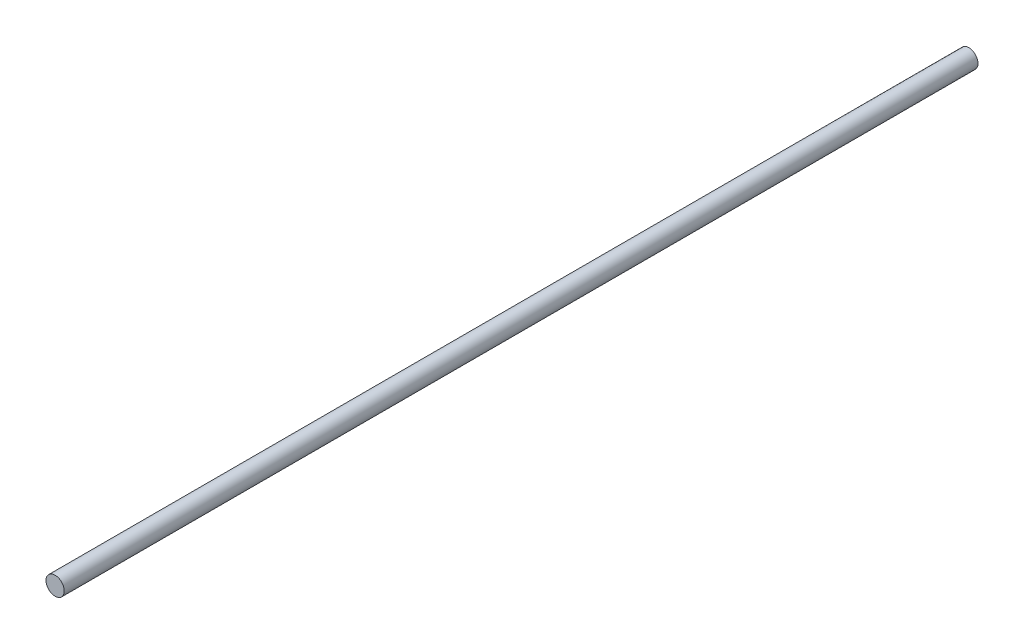
ISO-10303-21;
HEADER;
FILE_DESCRIPTION(('STEP AP214'),'2;1');
FILE_NAME('part.step','',(''),(''),'','','');
FILE_SCHEMA(('AUTOMOTIVE_DESIGN { 1 0 10303 214 1 1 1 1 }'));
ENDSEC;
DATA;
#1=APPLICATION_CONTEXT('core data for automotive mechanical design processes');
#2=APPLICATION_PROTOCOL_DEFINITION('international standard','automotive_design',2000,#1);
#3=PRODUCT_CONTEXT('',#1,'mechanical');
#4=PRODUCT('Part','Part','',(#3));
#5=PRODUCT_RELATED_PRODUCT_CATEGORY('part','',(#4));
#6=PRODUCT_DEFINITION_FORMATION('','',#4);
#7=PRODUCT_DEFINITION_CONTEXT('part definition',#1,'design');
#8=PRODUCT_DEFINITION('design','',#6,#7);
#9=PRODUCT_DEFINITION_SHAPE('','',#8);
#10=(LENGTH_UNIT() NAMED_UNIT(*) SI_UNIT(.MILLI.,.METRE.));
#11=(NAMED_UNIT(*) PLANE_ANGLE_UNIT() SI_UNIT($,.RADIAN.));
#12=(NAMED_UNIT(*) SI_UNIT($,.STERADIAN.) SOLID_ANGLE_UNIT());
#13=UNCERTAINTY_MEASURE_WITH_UNIT(LENGTH_MEASURE(1.E-05),#10,'distance_accuracy_value','');
#14=(GEOMETRIC_REPRESENTATION_CONTEXT(3) GLOBAL_UNCERTAINTY_ASSIGNED_CONTEXT((#13)) GLOBAL_UNIT_ASSIGNED_CONTEXT((#10,
#11,#12)) REPRESENTATION_CONTEXT('',''));
#15=CARTESIAN_POINT('',(0.,0.,0.));
#16=DIRECTION('',(0.,0.,1.));
#17=DIRECTION('',(1.,0.,0.));
#18=AXIS2_PLACEMENT_3D('',#15,#16,#17);
#19=CARTESIAN_POINT('',(0.,0.,50.));
#20=DIRECTION('',(0.,0.,-1.));
#21=DIRECTION('',(-1.,0.,0.));
#22=AXIS2_PLACEMENT_3D('',#19,#20,#21);
#23=CYLINDRICAL_SURFACE('',#22,1.);
#24=CARTESIAN_POINT('',(0.,0.,50.));
#25=DIRECTION('',(0.,0.,1.));
#26=DIRECTION('',(1.,0.,0.));
#27=AXIS2_PLACEMENT_3D('',#24,#25,#26);
#28=CIRCLE('',#27,1.);
#29=CARTESIAN_POINT('',(1.,0.,50.));
#30=VERTEX_POINT('',#29);
#31=EDGE_CURVE('E10',#30,#30,#28,.T.);
#32=ORIENTED_EDGE('',*,*,#31,.F.);
#33=EDGE_LOOP('',(#32));
#34=FACE_BOUND('',#33,.T.);
#35=CARTESIAN_POINT('',(0.,0.,-50.));
#36=DIRECTION('',(0.,0.,1.));
#37=DIRECTION('',(1.,0.,0.));
#38=AXIS2_PLACEMENT_3D('',#35,#36,#37);
#39=CIRCLE('',#38,1.);
#40=CARTESIAN_POINT('',(1.,0.,-50.));
#41=VERTEX_POINT('',#40);
#42=EDGE_CURVE('E38',#41,#41,#39,.T.);
#43=ORIENTED_EDGE('',*,*,#42,.T.);
#44=EDGE_LOOP('',(#43));
#45=FACE_BOUND('',#44,.T.);
#46=ADVANCED_FACE('F35',(#34,#45),#23,.T.);
#47=CARTESIAN_POINT('',(0.,0.,50.));
#48=DIRECTION('',(0.,0.,1.));
#49=DIRECTION('',(1.,0.,0.));
#50=AXIS2_PLACEMENT_3D('',#47,#48,#49);
#51=PLANE('',#50);
#52=ORIENTED_EDGE('',*,*,#31,.T.);
#53=EDGE_LOOP('',(#52));
#54=FACE_BOUND('',#53,.T.);
#55=ADVANCED_FACE('F50',(#54),#51,.T.);
#56=CARTESIAN_POINT('',(0.,0.,-50.));
#57=DIRECTION('',(0.,0.,1.));
#58=DIRECTION('',(1.,0.,0.));
#59=AXIS2_PLACEMENT_3D('',#56,#57,#58);
#60=PLANE('',#59);
#61=ORIENTED_EDGE('',*,*,#42,.F.);
#62=EDGE_LOOP('',(#61));
#63=FACE_BOUND('',#62,.T.);
#64=ADVANCED_FACE('F48',(#63),#60,.F.);
#65=CLOSED_SHELL('',(#46,#55,#64));
#66=MANIFOLD_SOLID_BREP('B2',#65);
#67=ADVANCED_BREP_SHAPE_REPRESENTATION('',(#18,#66),#14);
#68=SHAPE_DEFINITION_REPRESENTATION(#9,#67);
ENDSEC;
END-ISO-10303-21;
